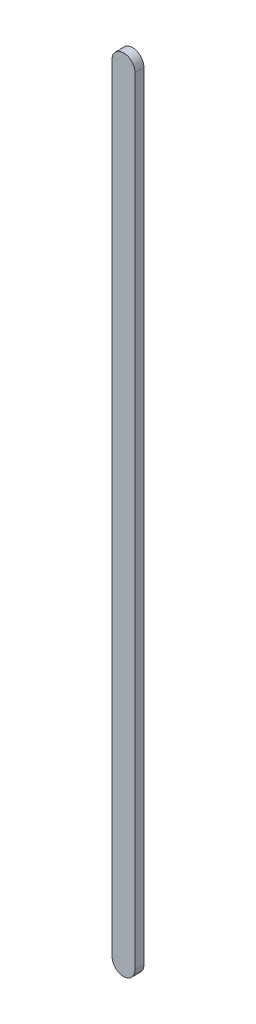
ISO-10303-21;
HEADER;
FILE_DESCRIPTION(('STEP AP214'),'2;1');
FILE_NAME('part.step','',(''),(''),'','','');
FILE_SCHEMA(('AUTOMOTIVE_DESIGN { 1 0 10303 214 1 1 1 1 }'));
ENDSEC;
DATA;
#1=APPLICATION_CONTEXT('core data for automotive mechanical design processes');
#2=APPLICATION_PROTOCOL_DEFINITION('international standard','automotive_design',2000,#1);
#3=PRODUCT_CONTEXT('',#1,'mechanical');
#4=PRODUCT('Part','Part','',(#3));
#5=PRODUCT_RELATED_PRODUCT_CATEGORY('part','',(#4));
#6=PRODUCT_DEFINITION_FORMATION('','',#4);
#7=PRODUCT_DEFINITION_CONTEXT('part definition',#1,'design');
#8=PRODUCT_DEFINITION('design','',#6,#7);
#9=PRODUCT_DEFINITION_SHAPE('','',#8);
#10=(LENGTH_UNIT() NAMED_UNIT(*) SI_UNIT(.MILLI.,.METRE.));
#11=(NAMED_UNIT(*) PLANE_ANGLE_UNIT() SI_UNIT($,.RADIAN.));
#12=(NAMED_UNIT(*) SI_UNIT($,.STERADIAN.) SOLID_ANGLE_UNIT());
#13=UNCERTAINTY_MEASURE_WITH_UNIT(LENGTH_MEASURE(1.E-05),#10,'distance_accuracy_value','');
#14=(GEOMETRIC_REPRESENTATION_CONTEXT(3) GLOBAL_UNCERTAINTY_ASSIGNED_CONTEXT((#13)) GLOBAL_UNIT_ASSIGNED_CONTEXT((#10,
#11,#12)) REPRESENTATION_CONTEXT('',''));
#15=CARTESIAN_POINT('',(0.,0.,0.));
#16=DIRECTION('',(0.,0.,1.));
#17=DIRECTION('',(1.,0.,0.));
#18=AXIS2_PLACEMENT_3D('',#15,#16,#17);
#19=CARTESIAN_POINT('',(140.081,66.87162902,0.));
#20=DIRECTION('',(-1.,0.,0.));
#21=DIRECTION('',(0.,1.,0.));
#22=AXIS2_PLACEMENT_3D('',#19,#20,#21);
#23=PLANE('',#22);
#24=DIRECTION('',(0.,1.,0.));
#25=VECTOR('',#24,1.);
#26=CARTESIAN_POINT('',(140.081,66.87162902,0.1999996));
#27=LINE('',#26,#25);
#28=CARTESIAN_POINT('',(140.081,66.87162902,0.1999996));
#29=VERTEX_POINT('',#28);
#30=CARTESIAN_POINT('',(140.081,84.08736548,0.1999996));
#31=VERTEX_POINT('',#30);
#32=EDGE_CURVE('E11',#29,#31,#27,.T.);
#33=ORIENTED_EDGE('',*,*,#32,.F.);
#34=DIRECTION('',(0.,0.,1.));
#35=VECTOR('',#34,1.);
#36=CARTESIAN_POINT('',(140.081,66.87162902,0.));
#37=LINE('',#36,#35);
#38=CARTESIAN_POINT('',(140.081,66.87162902,0.));
#39=VERTEX_POINT('',#38);
#40=EDGE_CURVE('E24',#39,#29,#37,.T.);
#41=ORIENTED_EDGE('',*,*,#40,.F.);
#42=DIRECTION('',(0.,1.,0.));
#43=VECTOR('',#42,1.);
#44=CARTESIAN_POINT('',(140.081,66.87162902,0.));
#45=LINE('',#44,#43);
#46=CARTESIAN_POINT('',(140.081,84.08736548,0.));
#47=VERTEX_POINT('',#46);
#48=EDGE_CURVE('E75',#39,#47,#45,.T.);
#49=ORIENTED_EDGE('',*,*,#48,.T.);
#50=DIRECTION('',(0.,0.,1.));
#51=VECTOR('',#50,1.);
#52=CARTESIAN_POINT('',(140.081,84.08736548,0.));
#53=LINE('',#52,#51);
#54=EDGE_CURVE('E37',#47,#31,#53,.T.);
#55=ORIENTED_EDGE('',*,*,#54,.T.);
#56=EDGE_LOOP('',(#33,#41,#49,#55));
#57=FACE_BOUND('',#56,.T.);
#58=ADVANCED_FACE('F17',(#57),#23,.F.);
#59=CARTESIAN_POINT('',(139.827,84.08736548,0.));
#60=DIRECTION('',(0.,0.,-1.));
#61=DIRECTION('',(1.,0.,0.));
#62=AXIS2_PLACEMENT_3D('',#59,#60,#61);
#63=CYLINDRICAL_SURFACE('',#62,0.254);
#64=CARTESIAN_POINT('',(139.827,84.08736548,0.1999996));
#65=DIRECTION('',(0.,0.,1.));
#66=DIRECTION('',(1.,0.,0.));
#67=AXIS2_PLACEMENT_3D('',#64,#65,#66);
#68=CIRCLE('',#67,0.254);
#69=CARTESIAN_POINT('',(139.573,84.08736548,0.1999996));
#70=VERTEX_POINT('',#69);
#71=EDGE_CURVE('E83',#31,#70,#68,.T.);
#72=ORIENTED_EDGE('',*,*,#71,.F.);
#73=ORIENTED_EDGE('',*,*,#54,.F.);
#74=CARTESIAN_POINT('',(139.827,84.08736548,0.));
#75=DIRECTION('',(0.,0.,1.));
#76=DIRECTION('',(1.,0.,0.));
#77=AXIS2_PLACEMENT_3D('',#74,#75,#76);
#78=CIRCLE('',#77,0.254);
#79=CARTESIAN_POINT('',(139.573,84.08736548,0.));
#80=VERTEX_POINT('',#79);
#81=EDGE_CURVE('E81',#47,#80,#78,.T.);
#82=ORIENTED_EDGE('',*,*,#81,.T.);
#83=DIRECTION('',(0.,0.,1.));
#84=VECTOR('',#83,1.);
#85=CARTESIAN_POINT('',(139.573,84.08736548,0.));
#86=LINE('',#85,#84);
#87=EDGE_CURVE('E67',#80,#70,#86,.T.);
#88=ORIENTED_EDGE('',*,*,#87,.T.);
#89=EDGE_LOOP('',(#72,#73,#82,#88));
#90=FACE_BOUND('',#89,.T.);
#91=ADVANCED_FACE('F89',(#90),#63,.T.);
#92=CARTESIAN_POINT('',(139.573,84.08736548,0.));
#93=DIRECTION('',(1.,0.,0.));
#94=DIRECTION('',(0.,-1.,0.));
#95=AXIS2_PLACEMENT_3D('',#92,#93,#94);
#96=PLANE('',#95);
#97=DIRECTION('',(0.,-1.,0.));
#98=VECTOR('',#97,1.);
#99=CARTESIAN_POINT('',(139.573,84.08736548,0.1999996));
#100=LINE('',#99,#98);
#101=CARTESIAN_POINT('',(139.573,66.87162902,0.1999996));
#102=VERTEX_POINT('',#101);
#103=EDGE_CURVE('E71',#70,#102,#100,.T.);
#104=ORIENTED_EDGE('',*,*,#103,.F.);
#105=ORIENTED_EDGE('',*,*,#87,.F.);
#106=DIRECTION('',(0.,-1.,0.));
#107=VECTOR('',#106,1.);
#108=CARTESIAN_POINT('',(139.573,84.08736548,0.));
#109=LINE('',#108,#107);
#110=CARTESIAN_POINT('',(139.573,66.87162902,0.));
#111=VERTEX_POINT('',#110);
#112=EDGE_CURVE('E63',#80,#111,#109,.T.);
#113=ORIENTED_EDGE('',*,*,#112,.T.);
#114=DIRECTION('',(0.,0.,1.));
#115=VECTOR('',#114,1.);
#116=CARTESIAN_POINT('',(139.573,66.87162902,0.));
#117=LINE('',#116,#115);
#118=EDGE_CURVE('E53',#111,#102,#117,.T.);
#119=ORIENTED_EDGE('',*,*,#118,.T.);
#120=EDGE_LOOP('',(#104,#105,#113,#119));
#121=FACE_BOUND('',#120,.T.);
#122=ADVANCED_FACE('F66',(#121),#96,.F.);
#123=CARTESIAN_POINT('',(139.827,66.87162902,0.));
#124=DIRECTION('',(0.,0.,-1.));
#125=DIRECTION('',(-1.,0.,0.));
#126=AXIS2_PLACEMENT_3D('',#123,#124,#125);
#127=CYLINDRICAL_SURFACE('',#126,0.253999999999995);
#128=CARTESIAN_POINT('',(139.827,66.87162902,0.1999996));
#129=DIRECTION('',(0.,0.,1.));
#130=DIRECTION('',(-1.,0.,0.));
#131=AXIS2_PLACEMENT_3D('',#128,#129,#130);
#132=CIRCLE('',#131,0.253999999999995);
#133=EDGE_CURVE('E59',#102,#29,#132,.T.);
#134=ORIENTED_EDGE('',*,*,#133,.F.);
#135=ORIENTED_EDGE('',*,*,#118,.F.);
#136=CARTESIAN_POINT('',(139.827,66.87162902,0.));
#137=DIRECTION('',(0.,0.,1.));
#138=DIRECTION('',(-1.,0.,0.));
#139=AXIS2_PLACEMENT_3D('',#136,#137,#138);
#140=CIRCLE('',#139,0.253999999999995);
#141=EDGE_CURVE('E57',#111,#39,#140,.T.);
#142=ORIENTED_EDGE('',*,*,#141,.T.);
#143=ORIENTED_EDGE('',*,*,#40,.T.);
#144=EDGE_LOOP('',(#134,#135,#142,#143));
#145=FACE_BOUND('',#144,.T.);
#146=ADVANCED_FACE('F55',(#145),#127,.T.);
#147=CARTESIAN_POINT('',(140.081,66.87162902,0.));
#148=DIRECTION('',(0.,0.,-1.));
#149=DIRECTION('',(-1.,0.,0.));
#150=AXIS2_PLACEMENT_3D('',#147,#148,#149);
#151=PLANE('',#150);
#152=ORIENTED_EDGE('',*,*,#141,.F.);
#153=ORIENTED_EDGE('',*,*,#112,.F.);
#154=ORIENTED_EDGE('',*,*,#81,.F.);
#155=ORIENTED_EDGE('',*,*,#48,.F.);
#156=EDGE_LOOP('',(#152,#153,#154,#155));
#157=FACE_BOUND('',#156,.T.);
#158=ADVANCED_FACE('F74',(#157),#151,.T.);
#159=CARTESIAN_POINT('',(140.081,66.87162902,0.1999996));
#160=DIRECTION('',(0.,0.,-1.));
#161=DIRECTION('',(-1.,0.,0.));
#162=AXIS2_PLACEMENT_3D('',#159,#160,#161);
#163=PLANE('',#162);
#164=ORIENTED_EDGE('',*,*,#32,.T.);
#165=ORIENTED_EDGE('',*,*,#71,.T.);
#166=ORIENTED_EDGE('',*,*,#103,.T.);
#167=ORIENTED_EDGE('',*,*,#133,.T.);
#168=EDGE_LOOP('',(#164,#165,#166,#167));
#169=FACE_BOUND('',#168,.T.);
#170=ADVANCED_FACE('F91',(#169),#163,.F.);
#171=CLOSED_SHELL('',(#58,#91,#122,#146,#158,#170));
#172=MANIFOLD_SOLID_BREP('B1',#171);
#173=ADVANCED_BREP_SHAPE_REPRESENTATION('',(#18,#172),#14);
#174=SHAPE_DEFINITION_REPRESENTATION(#9,#173);
ENDSEC;
END-ISO-10303-21;
